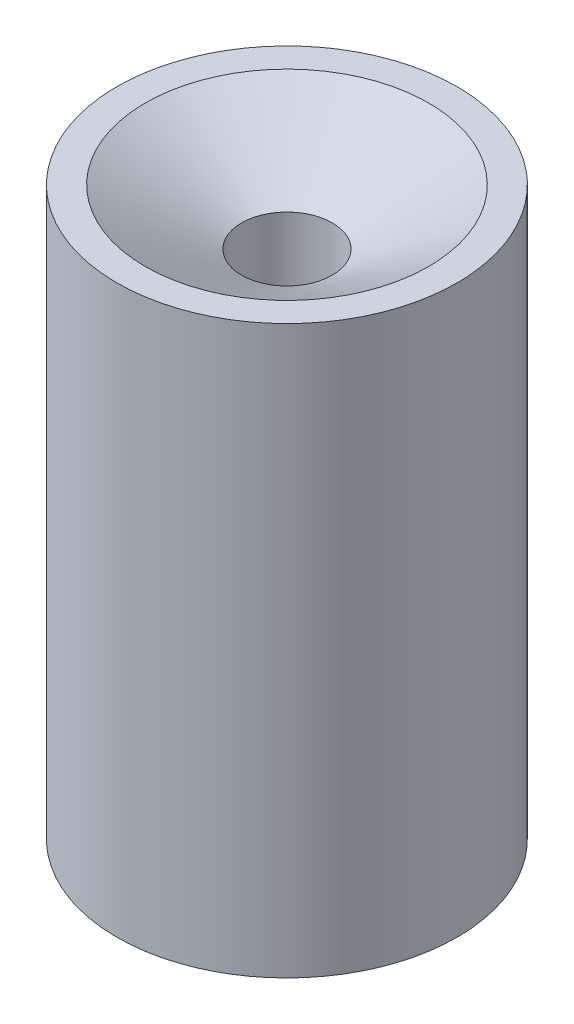
ISO-10303-21;
HEADER;
FILE_DESCRIPTION(('STEP AP214'),'2;1');
FILE_NAME('part.step','',(''),(''),'','','');
FILE_SCHEMA(('AUTOMOTIVE_DESIGN { 1 0 10303 214 1 1 1 1 }'));
ENDSEC;
DATA;
#1=APPLICATION_CONTEXT('core data for automotive mechanical design processes');
#2=APPLICATION_PROTOCOL_DEFINITION('international standard','automotive_design',2000,#1);
#3=PRODUCT_CONTEXT('',#1,'mechanical');
#4=PRODUCT('Part','Part','',(#3));
#5=PRODUCT_RELATED_PRODUCT_CATEGORY('part','',(#4));
#6=PRODUCT_DEFINITION_FORMATION('','',#4);
#7=PRODUCT_DEFINITION_CONTEXT('part definition',#1,'design');
#8=PRODUCT_DEFINITION('design','',#6,#7);
#9=PRODUCT_DEFINITION_SHAPE('','',#8);
#10=(LENGTH_UNIT() NAMED_UNIT(*) SI_UNIT(.MILLI.,.METRE.));
#11=(NAMED_UNIT(*) PLANE_ANGLE_UNIT() SI_UNIT($,.RADIAN.));
#12=(NAMED_UNIT(*) SI_UNIT($,.STERADIAN.) SOLID_ANGLE_UNIT());
#13=UNCERTAINTY_MEASURE_WITH_UNIT(LENGTH_MEASURE(1.E-05),#10,'distance_accuracy_value','');
#14=(GEOMETRIC_REPRESENTATION_CONTEXT(3) GLOBAL_UNCERTAINTY_ASSIGNED_CONTEXT((#13)) GLOBAL_UNIT_ASSIGNED_CONTEXT((#10,
#11,#12)) REPRESENTATION_CONTEXT('',''));
#15=CARTESIAN_POINT('',(0.,0.,0.));
#16=DIRECTION('',(0.,0.,1.));
#17=DIRECTION('',(1.,0.,0.));
#18=AXIS2_PLACEMENT_3D('',#15,#16,#17);
#19=CARTESIAN_POINT('',(0.,9.018504542,0.8));
#20=CARTESIAN_POINT('',(0.,10.,2.5));
#21=(BOUNDED_CURVE() B_SPLINE_CURVE(1,(#19,#20),.UNSPECIFIED.,.F.,
.F.) B_SPLINE_CURVE_WITH_KNOTS((2,2),(0.,1.),
.UNSPECIFIED.) CURVE() GEOMETRIC_REPRESENTATION_ITEM() RATIONAL_B_SPLINE_CURVE((1.,1.)) REPRESENTATION_ITEM(''));
#22=CARTESIAN_POINT('',(0.,-990.981495458,0.));
#23=DIRECTION('',(0.,1.,0.));
#24=AXIS1_PLACEMENT('',#22,#23);
#25=SURFACE_OF_REVOLUTION('',#21,#24);
#26=CARTESIAN_POINT('',(0.,9.018504542,0.));
#27=DIRECTION('',(0.,-1.,0.));
#28=DIRECTION('',(0.,0.,-1.));
#29=AXIS2_PLACEMENT_3D('',#26,#27,#28);
#30=CIRCLE('',#29,0.8);
#31=CARTESIAN_POINT('',(0.,9.018504542,-0.8));
#32=VERTEX_POINT('',#31);
#33=EDGE_CURVE('E20',#32,#32,#30,.F.);
#34=ORIENTED_EDGE('',*,*,#33,.F.);
#35=EDGE_LOOP('',(#34));
#36=FACE_BOUND('',#35,.T.);
#37=CARTESIAN_POINT('',(0.,9.9999999999999,0.));
#38=DIRECTION('',(0.,1.,0.));
#39=DIRECTION('',(0.,0.,1.));
#40=AXIS2_PLACEMENT_3D('',#37,#38,#39);
#41=CIRCLE('',#40,2.5);
#42=CARTESIAN_POINT('',(0.,9.9999999999999,2.5));
#43=VERTEX_POINT('',#42);
#44=EDGE_CURVE('E84',#43,#43,#41,.F.);
#45=ORIENTED_EDGE('',*,*,#44,.F.);
#46=EDGE_LOOP('',(#45));
#47=FACE_BOUND('',#46,.T.);
#48=ADVANCED_FACE('F15',(#36,#47),#25,.F.);
#49=CARTESIAN_POINT('',(-3.036,10.,-3.036));
#50=DIRECTION('',(0.,1.,0.));
#51=DIRECTION('',(0.,0.,1.));
#52=AXIS2_PLACEMENT_3D('',#49,#50,#51);
#53=PLANE('',#52);
#54=ORIENTED_EDGE('',*,*,#44,.T.);
#55=EDGE_LOOP('',(#54));
#56=FACE_BOUND('',#55,.T.);
#57=CARTESIAN_POINT('',(-1.79585082180927E-10,10.,-3.));
#58=CARTESIAN_POINT('',(-0.0842305921750378,10.,-2.99999949522854));
#59=CARTESIAN_POINT('',(-0.168476663816767,10.,-2.99644943210249));
#60=CARTESIAN_POINT('',(-0.336386615205739,10.,-2.98227226002267));
#61=CARTESIAN_POINT('',(-0.420050315701042,10.,-2.97164306170328));
#62=CARTESIAN_POINT('',(-0.586325719994559,10.,-2.9433554403765));
#63=CARTESIAN_POINT('',(-0.668935538006743,10.,-2.92568585927662));
#64=CARTESIAN_POINT('',(-0.832418927670488,10.,-2.88343927181851));
#65=CARTESIAN_POINT('',(-0.913291032780675,10.,-2.85885666003996));
#66=CARTESIAN_POINT('',(-1.15208821042353,10.,-2.77507914668652));
#67=CARTESIAN_POINT('',(-1.30659602074704,10.,-2.70578575357263));
#68=CARTESIAN_POINT('',(-1.60176804528835,10.,-2.54220609659893));
#69=CARTESIAN_POINT('',(-1.7424317329735,10.,-2.44791888265401));
#70=CARTESIAN_POINT('',(-1.9399880430317,10.,-2.2898892514552));
#71=CARTESIAN_POINT('',(-2.00363749105151,10.,-2.23440451662689));
#72=CARTESIAN_POINT('',(-2.12599212156537,10.,-2.11831409184965));
#73=CARTESIAN_POINT('',(-2.18470201190841,10.,-2.05771339085062));
#74=CARTESIAN_POINT('',(-2.29683361022014,10.,-1.93175254690532));
#75=CARTESIAN_POINT('',(-2.35025291063919,10.,-1.86639026040711));
#76=CARTESIAN_POINT('',(-2.45140072832907,10.,-1.7314038327038));
#77=CARTESIAN_POINT('',(-2.49912792468452,10.,-1.6617787079112));
#78=CARTESIAN_POINT('',(-2.63320682475734,10.,-1.44726826368351));
#79=CARTESIAN_POINT('',(-2.71057412209261,10.,-1.29661475805599));
#80=CARTESIAN_POINT('',(-2.83887092032264,10.,-0.984538397769613));
#81=CARTESIAN_POINT('',(-2.88980070358241,10.,-0.823115658151992));
#82=CARTESIAN_POINT('',(-2.96385049100085,10.,-0.493990143211312));
#83=CARTESIAN_POINT('',(-2.98697034664271,10.,-0.326287334354949));
#84=CARTESIAN_POINT('',(-3.00472003813866,10.,0.0106192603936318));
#85=CARTESIAN_POINT('',(-2.99934987399276,10.,0.17982304628585));
#86=CARTESIAN_POINT('',(-2.96029352943515,10.,0.514907479752218));
#87=CARTESIAN_POINT('',(-2.92660750024165,10.,0.680788145068337));
#88=CARTESIAN_POINT('',(-2.83181297787941,10.,1.00461791765848));
#89=CARTESIAN_POINT('',(-2.77070419182062,10.,1.16256694019818));
#90=CARTESIAN_POINT('',(-2.65990764648401,10.,1.38997847831572));
#91=CARTESIAN_POINT('',(-2.61976066024325,10.,1.4642331937897));
#92=CARTESIAN_POINT('',(-2.533356751595,10.,1.60910065479403));
#93=CARTESIAN_POINT('',(-2.48710124614281,10.,1.67971423966904));
#94=CARTESIAN_POINT('',(-2.38882598111958,10.,1.81676022403913));
#95=CARTESIAN_POINT('',(-2.33680884100812,10.,1.88319450224164));
#96=CARTESIAN_POINT('',(-2.22732998385631,10.,2.01149891436323));
#97=CARTESIAN_POINT('',(-2.16986306080548,10.,2.07336458163727));
#98=CARTESIAN_POINT('',(-1.99000567815265,10.,2.25127799284035));
#99=CARTESIAN_POINT('',(-1.86002810586064,10.,2.35982375483851));
#100=CARTESIAN_POINT('',(-1.58367858014144,10.,2.55351363036695));
#101=CARTESIAN_POINT('',(-1.43730725016412,10.,2.63865863339631));
#102=CARTESIAN_POINT('',(-1.20863511838851,10.,2.74706444478656));
#103=CARTESIAN_POINT('',(-1.13079377999063,10.,2.78000876483221));
#104=CARTESIAN_POINT('',(-0.972654562407022,10.,2.83919981745005));
#105=CARTESIAN_POINT('',(-0.892358730644588,10.,2.86545197031175));
#106=CARTESIAN_POINT('',(-0.729976188975372,10.,2.91105470876429));
#107=CARTESIAN_POINT('',(-0.647892526873583,10.,2.93041619252482));
#108=CARTESIAN_POINT('',(-0.482401803634151,10.,2.96215834911786));
#109=CARTESIAN_POINT('',(-0.398995140300326,10.,2.97454108091422));
#110=CARTESIAN_POINT('',(-0.262882669770961,10.,2.98892380783833));
#111=CARTESIAN_POINT('',(-0.210394788269591,10.,2.99307606546448));
#112=CARTESIAN_POINT('',(-0.105273286690342,10.,2.99861431926428));
#113=CARTESIAN_POINT('',(-0.0526396666124634,10.,3.00000031543792));
#114=CARTESIAN_POINT('',(0.08423059117464,10.,2.99999949525662));
#115=CARTESIAN_POINT('',(0.168476662817318,10.,2.99644943215868));
#116=CARTESIAN_POINT('',(0.336386614210605,10.,2.98227226013492));
#117=CARTESIAN_POINT('',(0.420050314709274,10.,2.97164306184346));
#118=CARTESIAN_POINT('',(0.586325719012307,10.,2.94335544057218));
#119=CARTESIAN_POINT('',(0.668935537030642,10.,2.92568585949981));
#120=CARTESIAN_POINT('',(0.832418926708934,10.,2.88343927209611));
#121=CARTESIAN_POINT('',(0.913291031827523,10.,2.85885666034446));
#122=CARTESIAN_POINT('',(1.15208820949849,10.,2.77507914707055));
#123=CARTESIAN_POINT('',(1.30659601984509,10.,2.70578575400817));
#124=CARTESIAN_POINT('',(1.60176804444093,10.,2.54220609713286));
#125=CARTESIAN_POINT('',(1.74243173215752,10.,2.44791888323482));
#126=CARTESIAN_POINT('',(1.93998804226839,10.,2.28988925210187));
#127=CARTESIAN_POINT('',(2.00363749030669,10.,2.23440451729478));
#128=CARTESIAN_POINT('',(2.12599212085923,10.,2.11831409255835));
#129=CARTESIAN_POINT('',(2.18470201122247,10.,2.0577133915789));
#130=CARTESIAN_POINT('',(2.29683360957618,10.,1.93175254767098));
#131=CARTESIAN_POINT('',(2.35025291001703,10.,1.86639026119057));
#132=CARTESIAN_POINT('',(2.45140072775192,10.,1.73140383352095));
#133=CARTESIAN_POINT('',(2.49912792413059,10.,1.66177870874426));
#134=CARTESIAN_POINT('',(2.63320682427492,10.,1.44726826456124));
#135=CARTESIAN_POINT('',(2.71057412166041,10.,1.2966147589595));
#136=CARTESIAN_POINT('',(2.83887091999447,10.,0.984538398715893));
#137=CARTESIAN_POINT('',(2.88980070330804,10.,0.823115659115253));
#138=CARTESIAN_POINT('',(2.96385049083619,10.,0.493990144199262));
#139=CARTESIAN_POINT('',(2.98697034653395,10.,0.326287335350607));
#140=CARTESIAN_POINT('',(3.0047200381422,10.,-0.0106192593920573));
#141=CARTESIAN_POINT('',(2.99934987405271,10.,-0.179823045286067));
#142=CARTESIAN_POINT('',(2.96029352960678,10.,-0.51490747876546));
#143=CARTESIAN_POINT('',(2.92660750046858,10.,-0.680788144092813));
#144=CARTESIAN_POINT('',(2.83181297821428,10.,-1.00461791671455));
#145=CARTESIAN_POINT('',(2.77070419220814,10.,-1.16256693927462));
#146=CARTESIAN_POINT('',(2.65990764694734,10.,-1.38997847742907));
#147=CARTESIAN_POINT('',(2.61976066073134,10.,-1.46423319291642));
#148=CARTESIAN_POINT('',(2.53335675213139,10.,-1.60910065394954));
#149=CARTESIAN_POINT('',(2.48710124670275,10.,-1.67971423883995));
#150=CARTESIAN_POINT('',(2.38882598172521,10.,-1.8167602232428));
#151=CARTESIAN_POINT('',(2.33680884163588,10.,-1.88319450146267));
#152=CARTESIAN_POINT('',(2.22732998452683,10.,-2.01149891362077));
#153=CARTESIAN_POINT('',(2.16986306149661,10.,-2.07336458091398));
#154=CARTESIAN_POINT('',(1.99000567890308,10.,-2.25127799217701));
#155=CARTESIAN_POINT('',(1.86002810664727,10.,-2.35982375421849));
#156=CARTESIAN_POINT('',(1.58367858099263,10.,-2.55351362983904));
#157=CARTESIAN_POINT('',(1.43730725104369,10.,-2.63865863291721));
#158=CARTESIAN_POINT('',(1.20863511930439,10.,-2.74706444438359));
#159=CARTESIAN_POINT('',(1.13079378091769,10.,-2.78000876445511));
#160=CARTESIAN_POINT('',(0.972654563354269,10.,-2.83919981712553));
#161=CARTESIAN_POINT('',(0.892358731600842,10.,-2.86545197001395));
#162=CARTESIAN_POINT('',(0.729976189946921,10.,-2.91105470852067));
#163=CARTESIAN_POINT('',(0.647892527851415,10.,-2.93041619230863));
#164=CARTESIAN_POINT('',(0.482401804622164,10.,-2.96215834895697));
#165=CARTESIAN_POINT('',(0.398995141292236,10.,-2.97454108078118));
#166=CARTESIAN_POINT('',(0.262882670435773,10.,-2.98892380778573));
#167=CARTESIAN_POINT('',(0.210394788602459,10.,-2.99307606544695));
#168=CARTESIAN_POINT('',(0.105273286357475,10.,-2.99861431928182));
#169=CARTESIAN_POINT('',(0.0526396659458053,10.,-3.00000031545547));
#170=CARTESIAN_POINT('',(-1.79585082180927E-10,10.,-3.));
#171=B_SPLINE_CURVE_WITH_KNOTS('',3,(#57,#58,#59,#60,#61,#62,#63,#64,#65,#66,#67,#68,#69,#70,
#71,#72,#73,#74,#75,#76,#77,#78,#79,#80,#81,#82,#83,#84,#85,#86,#87,#88,#89,#90,#91,#92,#93,#94,
#95,#96,#97,#98,#99,#100,#101,#102,#103,#104,#105,#106,#107,#108,#109,#110,#111,#112,#113,#114,
#115,#116,#117,#118,#119,#120,#121,#122,#123,#124,#125,#126,#127,#128,#129,#130,#131,#132,#133,
#134,#135,#136,#137,#138,#139,#140,#141,#142,#143,#144,#145,#146,#147,#148,#149,#150,#151,#152,
#153,#154,#155,#156,#157,#158,#159,#160,#161,#162,#163,#164,#165,#166,#167,#168,#169,#170),
.UNSPECIFIED.,.T.,.F.,(4,2,2,2,2,2,2,2,2,2,2,2,2,2,2,2,2,2,2,2,2,2,2,2,2,2,2,2,2,2,2,2,2,2,2,2,
2,2,2,2,2,2,2,2,2,2,2,2,2,2,2,2,2,2,2,2,4),(0.,0.252643316184543,0.505361231639865,
0.758481275542631,1.01180715618274,1.51725134291917,2.02271474576027,2.27577762012549,
2.52859650376464,2.78152991223796,3.03452190295018,3.53997839705089,4.04542949252892,
4.55088328731834,5.05633708210776,5.56178817758577,6.0672446716865,6.32023666239877,
6.57317007087212,6.82598895451123,7.07905182887641,7.58451523171754,8.08995941845395,
8.34328529909469,8.59640534299822,8.84912325845305,9.10176657463668,9.25965528719948,
9.41754399976228,9.67018731594591,9.92290523140074,10.1760252753043,10.429351155945,
10.9347953426814,11.4402587455226,11.6933216198877,11.9461405035268,12.1990739120002,
12.4520659027125,12.9575223968132,13.4629734922912,13.9684272870806,14.47388108187,
14.9793321773481,15.4847886714488,15.737780662161,15.9907140706343,16.2435329542735,
16.4965958286387,17.0020592314798,17.5075034182162,17.7608292988563,18.0139493427591,
18.2666672582144,18.519310574399,18.6771992879614,18.8350880015239),.UNSPECIFIED.);
#172=CARTESIAN_POINT('',(-1.79585082180927E-10,10.,-3.));
#173=VERTEX_POINT('',#172);
#174=EDGE_CURVE('E78',#173,#173,#171,.T.);
#175=ORIENTED_EDGE('',*,*,#174,.T.);
#176=EDGE_LOOP('',(#175));
#177=FACE_BOUND('',#176,.T.);
#178=ADVANCED_FACE('F85',(#56,#177),#53,.T.);
#179=CARTESIAN_POINT('',(0.,9.018504542,-0.8));
#180=CARTESIAN_POINT('',(0.,0.981495457999999,-0.8));
#181=(BOUNDED_CURVE() B_SPLINE_CURVE(1,(#179,#180),.UNSPECIFIED.,.F.,
.F.) B_SPLINE_CURVE_WITH_KNOTS((2,2),(0.,1.),
.UNSPECIFIED.) CURVE() GEOMETRIC_REPRESENTATION_ITEM() RATIONAL_B_SPLINE_CURVE((1.,1.)) REPRESENTATION_ITEM(''));
#182=CARTESIAN_POINT('',(0.,0.,0.));
#183=DIRECTION('',(0.,-1.,0.));
#184=AXIS1_PLACEMENT('',#182,#183);
#185=SURFACE_OF_REVOLUTION('',#181,#184);
#186=ORIENTED_EDGE('',*,*,#33,.T.);
#187=EDGE_LOOP('',(#186));
#188=FACE_BOUND('',#187,.T.);
#189=CARTESIAN_POINT('',(0.,0.98149545799997,0.));
#190=DIRECTION('',(0.,-1.,0.));
#191=DIRECTION('',(0.,0.,-1.));
#192=AXIS2_PLACEMENT_3D('',#189,#190,#191);
#193=CIRCLE('',#192,0.8);
#194=CARTESIAN_POINT('',(0.,0.981495458,-0.8));
#195=VERTEX_POINT('',#194);
#196=EDGE_CURVE('E35',#195,#195,#193,.F.);
#197=ORIENTED_EDGE('',*,*,#196,.F.);
#198=EDGE_LOOP('',(#197));
#199=FACE_BOUND('',#198,.T.);
#200=ADVANCED_FACE('F54',(#188,#199),#185,.F.);
#201=CARTESIAN_POINT('',(0.,10.,-3.));
#202=CARTESIAN_POINT('',(0.,0.,-3.));
#203=(BOUNDED_CURVE() B_SPLINE_CURVE(1,(#201,#202),.UNSPECIFIED.,.F.,
.F.) B_SPLINE_CURVE_WITH_KNOTS((2,2),(0.,1.),
.UNSPECIFIED.) CURVE() GEOMETRIC_REPRESENTATION_ITEM() RATIONAL_B_SPLINE_CURVE((1.,1.)) REPRESENTATION_ITEM(''));
#204=CARTESIAN_POINT('',(0.,10.,0.));
#205=DIRECTION('',(0.,-1.,0.));
#206=AXIS1_PLACEMENT('',#204,#205);
#207=SURFACE_OF_REVOLUTION('',#203,#206);
#208=ORIENTED_EDGE('',*,*,#174,.F.);
#209=EDGE_LOOP('',(#208));
#210=FACE_BOUND('',#209,.T.);
#211=CARTESIAN_POINT('',(-1.79585082180927E-10,0.,-3.));
#212=CARTESIAN_POINT('',(-0.0842305921750378,0.,-2.99999949522854));
#213=CARTESIAN_POINT('',(-0.168476663816767,0.,-2.99644943210249));
#214=CARTESIAN_POINT('',(-0.336386615205739,0.,-2.98227226002267));
#215=CARTESIAN_POINT('',(-0.420050315701042,0.,-2.97164306170328));
#216=CARTESIAN_POINT('',(-0.586325719994559,0.,-2.9433554403765));
#217=CARTESIAN_POINT('',(-0.668935538006743,0.,-2.92568585927662));
#218=CARTESIAN_POINT('',(-0.832418927670488,0.,-2.88343927181851));
#219=CARTESIAN_POINT('',(-0.913291032780675,0.,-2.85885666003996));
#220=CARTESIAN_POINT('',(-1.15208821042353,0.,-2.77507914668652));
#221=CARTESIAN_POINT('',(-1.30659602074704,0.,-2.70578575357263));
#222=CARTESIAN_POINT('',(-1.60176804528835,0.,-2.54220609659893));
#223=CARTESIAN_POINT('',(-1.7424317329735,0.,-2.44791888265401));
#224=CARTESIAN_POINT('',(-1.9399880430317,0.,-2.2898892514552));
#225=CARTESIAN_POINT('',(-2.00363749105151,0.,-2.23440451662689));
#226=CARTESIAN_POINT('',(-2.12599212156537,0.,-2.11831409184965));
#227=CARTESIAN_POINT('',(-2.18470201190841,0.,-2.05771339085062));
#228=CARTESIAN_POINT('',(-2.29683361022014,0.,-1.93175254690532));
#229=CARTESIAN_POINT('',(-2.35025291063919,0.,-1.86639026040711));
#230=CARTESIAN_POINT('',(-2.45140072832907,0.,-1.7314038327038));
#231=CARTESIAN_POINT('',(-2.49912792468452,0.,-1.6617787079112));
#232=CARTESIAN_POINT('',(-2.63320682475734,0.,-1.44726826368351));
#233=CARTESIAN_POINT('',(-2.71057412209261,0.,-1.29661475805599));
#234=CARTESIAN_POINT('',(-2.83887092032264,0.,-0.984538397769613));
#235=CARTESIAN_POINT('',(-2.88980070358241,0.,-0.823115658151992));
#236=CARTESIAN_POINT('',(-2.96385049100085,0.,-0.493990143211312));
#237=CARTESIAN_POINT('',(-2.98697034664271,0.,-0.326287334354949));
#238=CARTESIAN_POINT('',(-3.00472003813866,0.,0.0106192603936318));
#239=CARTESIAN_POINT('',(-2.99934987399276,0.,0.17982304628585));
#240=CARTESIAN_POINT('',(-2.96029352943515,0.,0.514907479752218));
#241=CARTESIAN_POINT('',(-2.92660750024165,0.,0.680788145068337));
#242=CARTESIAN_POINT('',(-2.83181297787941,0.,1.00461791765848));
#243=CARTESIAN_POINT('',(-2.77070419182062,0.,1.16256694019818));
#244=CARTESIAN_POINT('',(-2.65990764648401,0.,1.38997847831572));
#245=CARTESIAN_POINT('',(-2.61976066024325,0.,1.4642331937897));
#246=CARTESIAN_POINT('',(-2.533356751595,0.,1.60910065479403));
#247=CARTESIAN_POINT('',(-2.48710124614281,0.,1.67971423966904));
#248=CARTESIAN_POINT('',(-2.38882598111958,0.,1.81676022403913));
#249=CARTESIAN_POINT('',(-2.33680884100812,0.,1.88319450224164));
#250=CARTESIAN_POINT('',(-2.22732998385631,0.,2.01149891436323));
#251=CARTESIAN_POINT('',(-2.16986306080548,0.,2.07336458163727));
#252=CARTESIAN_POINT('',(-1.99000567815265,0.,2.25127799284035));
#253=CARTESIAN_POINT('',(-1.86002810586064,0.,2.35982375483851));
#254=CARTESIAN_POINT('',(-1.58367858014144,0.,2.55351363036695));
#255=CARTESIAN_POINT('',(-1.43730725016412,0.,2.63865863339631));
#256=CARTESIAN_POINT('',(-1.20863511838851,0.,2.74706444478656));
#257=CARTESIAN_POINT('',(-1.13079377999063,0.,2.78000876483221));
#258=CARTESIAN_POINT('',(-0.972654562407022,0.,2.83919981745005));
#259=CARTESIAN_POINT('',(-0.892358730644588,0.,2.86545197031175));
#260=CARTESIAN_POINT('',(-0.729976188975372,0.,2.91105470876429));
#261=CARTESIAN_POINT('',(-0.647892526873583,0.,2.93041619252482));
#262=CARTESIAN_POINT('',(-0.482401803634151,0.,2.96215834911786));
#263=CARTESIAN_POINT('',(-0.398995140300326,0.,2.97454108091422));
#264=CARTESIAN_POINT('',(-0.262882669770961,0.,2.98892380783833));
#265=CARTESIAN_POINT('',(-0.210394788269591,0.,2.99307606546448));
#266=CARTESIAN_POINT('',(-0.105273286690342,0.,2.99861431926428));
#267=CARTESIAN_POINT('',(-0.0526396666124634,0.,3.00000031543792));
#268=CARTESIAN_POINT('',(0.08423059117464,0.,2.99999949525662));
#269=CARTESIAN_POINT('',(0.168476662817318,0.,2.99644943215868));
#270=CARTESIAN_POINT('',(0.336386614210605,0.,2.98227226013492));
#271=CARTESIAN_POINT('',(0.420050314709274,0.,2.97164306184346));
#272=CARTESIAN_POINT('',(0.586325719012307,0.,2.94335544057218));
#273=CARTESIAN_POINT('',(0.668935537030642,0.,2.92568585949981));
#274=CARTESIAN_POINT('',(0.832418926708934,0.,2.88343927209611));
#275=CARTESIAN_POINT('',(0.913291031827523,0.,2.85885666034446));
#276=CARTESIAN_POINT('',(1.15208820949849,0.,2.77507914707055));
#277=CARTESIAN_POINT('',(1.30659601984509,0.,2.70578575400817));
#278=CARTESIAN_POINT('',(1.60176804444093,0.,2.54220609713286));
#279=CARTESIAN_POINT('',(1.74243173215752,0.,2.44791888323482));
#280=CARTESIAN_POINT('',(1.93998804226839,0.,2.28988925210187));
#281=CARTESIAN_POINT('',(2.00363749030669,0.,2.23440451729478));
#282=CARTESIAN_POINT('',(2.12599212085923,0.,2.11831409255835));
#283=CARTESIAN_POINT('',(2.18470201122247,0.,2.0577133915789));
#284=CARTESIAN_POINT('',(2.29683360957618,0.,1.93175254767098));
#285=CARTESIAN_POINT('',(2.35025291001703,0.,1.86639026119057));
#286=CARTESIAN_POINT('',(2.45140072775192,0.,1.73140383352095));
#287=CARTESIAN_POINT('',(2.49912792413059,0.,1.66177870874426));
#288=CARTESIAN_POINT('',(2.63320682427492,0.,1.44726826456124));
#289=CARTESIAN_POINT('',(2.71057412166041,0.,1.2966147589595));
#290=CARTESIAN_POINT('',(2.83887091999447,0.,0.984538398715893));
#291=CARTESIAN_POINT('',(2.88980070330804,0.,0.823115659115253));
#292=CARTESIAN_POINT('',(2.96385049083619,0.,0.493990144199262));
#293=CARTESIAN_POINT('',(2.98697034653395,0.,0.326287335350607));
#294=CARTESIAN_POINT('',(3.0047200381422,0.,-0.0106192593920573));
#295=CARTESIAN_POINT('',(2.99934987405271,0.,-0.179823045286067));
#296=CARTESIAN_POINT('',(2.96029352960678,0.,-0.51490747876546));
#297=CARTESIAN_POINT('',(2.92660750046858,0.,-0.680788144092813));
#298=CARTESIAN_POINT('',(2.83181297821428,0.,-1.00461791671455));
#299=CARTESIAN_POINT('',(2.77070419220814,0.,-1.16256693927462));
#300=CARTESIAN_POINT('',(2.65990764694734,0.,-1.38997847742907));
#301=CARTESIAN_POINT('',(2.61976066073134,0.,-1.46423319291642));
#302=CARTESIAN_POINT('',(2.53335675213139,0.,-1.60910065394954));
#303=CARTESIAN_POINT('',(2.48710124670275,0.,-1.67971423883995));
#304=CARTESIAN_POINT('',(2.38882598172521,0.,-1.8167602232428));
#305=CARTESIAN_POINT('',(2.33680884163588,0.,-1.88319450146267));
#306=CARTESIAN_POINT('',(2.22732998452683,0.,-2.01149891362077));
#307=CARTESIAN_POINT('',(2.16986306149661,0.,-2.07336458091398));
#308=CARTESIAN_POINT('',(1.99000567890308,0.,-2.25127799217701));
#309=CARTESIAN_POINT('',(1.86002810664727,0.,-2.35982375421849));
#310=CARTESIAN_POINT('',(1.58367858099263,0.,-2.55351362983904));
#311=CARTESIAN_POINT('',(1.43730725104369,0.,-2.63865863291721));
#312=CARTESIAN_POINT('',(1.20863511930439,0.,-2.74706444438359));
#313=CARTESIAN_POINT('',(1.13079378091769,0.,-2.78000876445511));
#314=CARTESIAN_POINT('',(0.972654563354269,0.,-2.83919981712553));
#315=CARTESIAN_POINT('',(0.892358731600842,0.,-2.86545197001395));
#316=CARTESIAN_POINT('',(0.729976189946921,0.,-2.91105470852067));
#317=CARTESIAN_POINT('',(0.647892527851415,0.,-2.93041619230863));
#318=CARTESIAN_POINT('',(0.482401804622164,0.,-2.96215834895697));
#319=CARTESIAN_POINT('',(0.398995141292236,0.,-2.97454108078118));
#320=CARTESIAN_POINT('',(0.262882670435773,0.,-2.98892380778573));
#321=CARTESIAN_POINT('',(0.210394788602459,0.,-2.99307606544695));
#322=CARTESIAN_POINT('',(0.105273286357475,0.,-2.99861431928182));
#323=CARTESIAN_POINT('',(0.0526396659458053,0.,-3.00000031545547));
#324=CARTESIAN_POINT('',(-1.79585082180927E-10,0.,-3.));
#325=B_SPLINE_CURVE_WITH_KNOTS('',3,(#211,#212,#213,#214,#215,#216,#217,#218,#219,#220,#221,
#222,#223,#224,#225,#226,#227,#228,#229,#230,#231,#232,#233,#234,#235,#236,#237,#238,#239,#240,
#241,#242,#243,#244,#245,#246,#247,#248,#249,#250,#251,#252,#253,#254,#255,#256,#257,#258,#259,
#260,#261,#262,#263,#264,#265,#266,#267,#268,#269,#270,#271,#272,#273,#274,#275,#276,#277,#278,
#279,#280,#281,#282,#283,#284,#285,#286,#287,#288,#289,#290,#291,#292,#293,#294,#295,#296,#297,
#298,#299,#300,#301,#302,#303,#304,#305,#306,#307,#308,#309,#310,#311,#312,#313,#314,#315,#316,
#317,#318,#319,#320,#321,#322,#323,#324),.UNSPECIFIED.,.T.,.F.,(4,2,2,2,2,2,2,2,2,2,2,2,2,2,2,2,
2,2,2,2,2,2,2,2,2,2,2,2,2,2,2,2,2,2,2,2,2,2,2,2,2,2,2,2,2,2,2,2,2,2,2,2,2,2,2,2,4),(0.,
0.252643316184543,0.505361231639865,0.758481275542631,1.01180715618274,1.51725134291917,
2.02271474576027,2.27577762012549,2.52859650376464,2.78152991223796,3.03452190295018,
3.53997839705089,4.04542949252892,4.55088328731834,5.05633708210776,5.56178817758577,
6.0672446716865,6.32023666239877,6.57317007087212,6.82598895451123,7.07905182887641,
7.58451523171754,8.08995941845395,8.34328529909469,8.59640534299822,8.84912325845305,
9.10176657463668,9.25965528719948,9.41754399976228,9.67018731594591,9.92290523140074,
10.1760252753043,10.429351155945,10.9347953426814,11.4402587455226,11.6933216198877,
11.9461405035268,12.1990739120002,12.4520659027125,12.9575223968132,13.4629734922912,
13.9684272870806,14.47388108187,14.9793321773481,15.4847886714488,15.737780662161,
15.9907140706343,16.2435329542735,16.4965958286387,17.0020592314798,17.5075034182162,
17.7608292988563,18.0139493427591,18.2666672582144,18.519310574399,18.6771992879614,
18.8350880015239),.UNSPECIFIED.);
#326=CARTESIAN_POINT('',(-1.79585082180927E-10,0.,-3.));
#327=VERTEX_POINT('',#326);
#328=EDGE_CURVE('E25',#327,#327,#325,.T.);
#329=ORIENTED_EDGE('',*,*,#328,.T.);
#330=EDGE_LOOP('',(#329));
#331=FACE_BOUND('',#330,.T.);
#332=ADVANCED_FACE('F48',(#210,#331),#207,.T.);
#333=CARTESIAN_POINT('',(-3.036,0.,-3.036));
#334=DIRECTION('',(0.,1.,0.));
#335=DIRECTION('',(0.,0.,1.));
#336=AXIS2_PLACEMENT_3D('',#333,#334,#335);
#337=PLANE('',#336);
#338=CARTESIAN_POINT('',(0.,0.,0.));
#339=DIRECTION('',(0.,-1.,0.));
#340=DIRECTION('',(0.,0.,-1.));
#341=AXIS2_PLACEMENT_3D('',#338,#339,#340);
#342=CIRCLE('',#341,2.5);
#343=CARTESIAN_POINT('',(0.,0.,-2.5));
#344=VERTEX_POINT('',#343);
#345=EDGE_CURVE('E10',#344,#344,#342,.T.);
#346=ORIENTED_EDGE('',*,*,#345,.F.);
#347=EDGE_LOOP('',(#346));
#348=FACE_BOUND('',#347,.T.);
#349=ORIENTED_EDGE('',*,*,#328,.F.);
#350=EDGE_LOOP('',(#349));
#351=FACE_BOUND('',#350,.T.);
#352=ADVANCED_FACE('F17',(#348,#351),#337,.F.);
#353=CARTESIAN_POINT('',(0.,0.981495458,-0.8));
#354=CARTESIAN_POINT('',(0.,0.,-2.5));
#355=(BOUNDED_CURVE() B_SPLINE_CURVE(1,(#353,#354),.UNSPECIFIED.,.F.,
.F.) B_SPLINE_CURVE_WITH_KNOTS((2,2),(0.,1.),
.UNSPECIFIED.) CURVE() GEOMETRIC_REPRESENTATION_ITEM() RATIONAL_B_SPLINE_CURVE((1.,1.)) REPRESENTATION_ITEM(''));
#356=CARTESIAN_POINT('',(0.,1000.,0.));
#357=DIRECTION('',(0.,-1.,0.));
#358=AXIS1_PLACEMENT('',#356,#357);
#359=SURFACE_OF_REVOLUTION('',#355,#358);
#360=ORIENTED_EDGE('',*,*,#196,.T.);
#361=EDGE_LOOP('',(#360));
#362=FACE_BOUND('',#361,.T.);
#363=ORIENTED_EDGE('',*,*,#345,.T.);
#364=EDGE_LOOP('',(#363));
#365=FACE_BOUND('',#364,.T.);
#366=ADVANCED_FACE('F56',(#362,#365),#359,.F.);
#367=CLOSED_SHELL('',(#48,#178,#200,#332,#352,#366));
#368=MANIFOLD_SOLID_BREP('B1',#367);
#369=ADVANCED_BREP_SHAPE_REPRESENTATION('',(#18,#368),#14);
#370=SHAPE_DEFINITION_REPRESENTATION(#9,#369);
ENDSEC;
END-ISO-10303-21;
